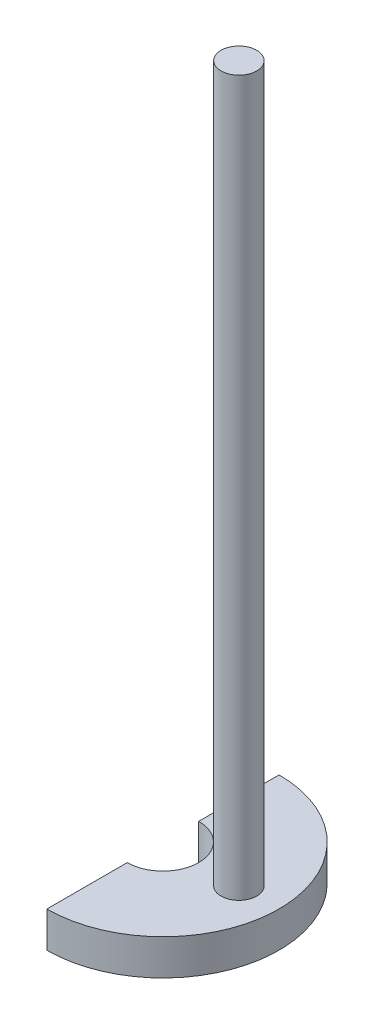
ISO-10303-21;
HEADER;
FILE_DESCRIPTION(('STEP AP214'),'2;1');
FILE_NAME('part.step','',(''),(''),'','','');
FILE_SCHEMA(('AUTOMOTIVE_DESIGN { 1 0 10303 214 1 1 1 1 }'));
ENDSEC;
DATA;
#1=APPLICATION_CONTEXT('core data for automotive mechanical design processes');
#2=APPLICATION_PROTOCOL_DEFINITION('international standard','automotive_design',2000,#1);
#3=PRODUCT_CONTEXT('',#1,'mechanical');
#4=PRODUCT('Part','Part','',(#3));
#5=PRODUCT_RELATED_PRODUCT_CATEGORY('part','',(#4));
#6=PRODUCT_DEFINITION_FORMATION('','',#4);
#7=PRODUCT_DEFINITION_CONTEXT('part definition',#1,'design');
#8=PRODUCT_DEFINITION('design','',#6,#7);
#9=PRODUCT_DEFINITION_SHAPE('','',#8);
#10=(LENGTH_UNIT() NAMED_UNIT(*) SI_UNIT(.MILLI.,.METRE.));
#11=(NAMED_UNIT(*) PLANE_ANGLE_UNIT() SI_UNIT($,.RADIAN.));
#12=(NAMED_UNIT(*) SI_UNIT($,.STERADIAN.) SOLID_ANGLE_UNIT());
#13=UNCERTAINTY_MEASURE_WITH_UNIT(LENGTH_MEASURE(1.E-05),#10,'distance_accuracy_value','');
#14=(GEOMETRIC_REPRESENTATION_CONTEXT(3) GLOBAL_UNCERTAINTY_ASSIGNED_CONTEXT((#13)) GLOBAL_UNIT_ASSIGNED_CONTEXT((#10,
#11,#12)) REPRESENTATION_CONTEXT('',''));
#15=CARTESIAN_POINT('',(0.,0.,0.));
#16=DIRECTION('',(0.,0.,1.));
#17=DIRECTION('',(1.,0.,0.));
#18=AXIS2_PLACEMENT_3D('',#15,#16,#17);
#19=CARTESIAN_POINT('',(0.,0.,0.));
#20=DIRECTION('',(1.,0.,0.));
#21=DIRECTION('',(0.,0.,-1.));
#22=AXIS2_PLACEMENT_3D('',#19,#20,#21);
#23=PLANE('',#22);
#24=DIRECTION('',(0.,0.,-1.));
#25=VECTOR('',#24,1.);
#26=CARTESIAN_POINT('',(0.,2.,0.));
#27=LINE('',#26,#25);
#28=CARTESIAN_POINT('',(0.,2.,6.5));
#29=VERTEX_POINT('',#28);
#30=CARTESIAN_POINT('',(0.,2.,2.));
#31=VERTEX_POINT('',#30);
#32=EDGE_CURVE('E57',#29,#31,#27,.T.);
#33=ORIENTED_EDGE('',*,*,#32,.T.);
#34=DIRECTION('',(0.,-1.,0.));
#35=VECTOR('',#34,1.);
#36=CARTESIAN_POINT('',(0.,2.,2.));
#37=LINE('',#36,#35);
#38=CARTESIAN_POINT('',(0.,0.,2.));
#39=VERTEX_POINT('',#38);
#40=EDGE_CURVE('E95',#31,#39,#37,.T.);
#41=ORIENTED_EDGE('',*,*,#40,.T.);
#42=DIRECTION('',(0.,0.,-1.));
#43=VECTOR('',#42,1.);
#44=CARTESIAN_POINT('',(0.,0.,0.));
#45=LINE('',#44,#43);
#46=CARTESIAN_POINT('',(0.,0.,6.5));
#47=VERTEX_POINT('',#46);
#48=EDGE_CURVE('E97',#47,#39,#45,.T.);
#49=ORIENTED_EDGE('',*,*,#48,.F.);
#50=DIRECTION('',(0.,-1.,0.));
#51=VECTOR('',#50,1.);
#52=CARTESIAN_POINT('',(0.,2.,6.5));
#53=LINE('',#52,#51);
#54=EDGE_CURVE('E51',#29,#47,#53,.T.);
#55=ORIENTED_EDGE('',*,*,#54,.F.);
#56=EDGE_LOOP('',(#33,#41,#49,#55));
#57=FACE_BOUND('',#56,.T.);
#58=ADVANCED_FACE('F47',(#57),#23,.F.);
#59=CARTESIAN_POINT('',(0.,2.,-2.));
#60=VERTEX_POINT('',#59);
#61=CARTESIAN_POINT('',(0.,2.,-6.5));
#62=VERTEX_POINT('',#61);
#63=EDGE_CURVE('E11',#60,#62,#27,.T.);
#64=ORIENTED_EDGE('',*,*,#63,.T.);
#65=DIRECTION('',(0.,-1.,0.));
#66=VECTOR('',#65,1.);
#67=CARTESIAN_POINT('',(0.,2.,-6.5));
#68=LINE('',#67,#66);
#69=CARTESIAN_POINT('',(0.,0.,-6.5));
#70=VERTEX_POINT('',#69);
#71=EDGE_CURVE('E72',#70,#62,#68,.F.);
#72=ORIENTED_EDGE('',*,*,#71,.F.);
#73=CARTESIAN_POINT('',(0.,0.,-2.));
#74=VERTEX_POINT('',#73);
#75=EDGE_CURVE('E102',#74,#70,#45,.T.);
#76=ORIENTED_EDGE('',*,*,#75,.F.);
#77=DIRECTION('',(0.,-1.,0.));
#78=VECTOR('',#77,1.);
#79=CARTESIAN_POINT('',(0.,2.,-2.));
#80=LINE('',#79,#78);
#81=EDGE_CURVE('E121',#74,#60,#80,.F.);
#82=ORIENTED_EDGE('',*,*,#81,.T.);
#83=EDGE_LOOP('',(#64,#72,#76,#82));
#84=FACE_BOUND('',#83,.T.);
#85=ADVANCED_FACE('F49',(#84),#23,.F.);
#86=CARTESIAN_POINT('',(4.25,42.,0.));
#87=DIRECTION('',(0.,1.,0.));
#88=DIRECTION('',(0.,0.,1.));
#89=AXIS2_PLACEMENT_3D('',#86,#87,#88);
#90=PLANE('',#89);
#91=CARTESIAN_POINT('',(4.25,42.,0.));
#92=DIRECTION('',(0.,1.,0.));
#93=DIRECTION('',(0.,0.,1.));
#94=AXIS2_PLACEMENT_3D('',#91,#92,#93);
#95=CIRCLE('',#94,1.);
#96=CARTESIAN_POINT('',(4.25,42.,0.999999999999999));
#97=VERTEX_POINT('',#96);
#98=EDGE_CURVE('E108',#97,#97,#95,.T.);
#99=ORIENTED_EDGE('',*,*,#98,.T.);
#100=EDGE_LOOP('',(#99));
#101=FACE_BOUND('',#100,.T.);
#102=ADVANCED_FACE('F148',(#101),#90,.T.);
#103=CARTESIAN_POINT('',(4.25,42.,0.));
#104=DIRECTION('',(0.,-1.,0.));
#105=DIRECTION('',(0.,0.,-1.));
#106=AXIS2_PLACEMENT_3D('',#103,#104,#105);
#107=CYLINDRICAL_SURFACE('',#106,1.);
#108=ORIENTED_EDGE('',*,*,#98,.F.);
#109=EDGE_LOOP('',(#108));
#110=FACE_BOUND('',#109,.T.);
#111=CARTESIAN_POINT('',(4.25,2.,0.));
#112=DIRECTION('',(0.,1.,0.));
#113=DIRECTION('',(0.,0.,1.));
#114=AXIS2_PLACEMENT_3D('',#111,#112,#113);
#115=CIRCLE('',#114,1.);
#116=CARTESIAN_POINT('',(4.25,2.,0.999999999999999));
#117=VERTEX_POINT('',#116);
#118=EDGE_CURVE('E114',#117,#117,#115,.T.);
#119=ORIENTED_EDGE('',*,*,#118,.T.);
#120=EDGE_LOOP('',(#119));
#121=FACE_BOUND('',#120,.T.);
#122=ADVANCED_FACE('F137',(#110,#121),#107,.T.);
#123=CARTESIAN_POINT('',(0.,2.,0.));
#124=DIRECTION('',(0.,-1.,0.));
#125=DIRECTION('',(0.,0.,-1.));
#126=AXIS2_PLACEMENT_3D('',#123,#124,#125);
#127=CYLINDRICAL_SURFACE('',#126,2.);
#128=ORIENTED_EDGE('',*,*,#40,.F.);
#129=CARTESIAN_POINT('',(0.,2.,0.));
#130=DIRECTION('',(0.,1.,0.));
#131=DIRECTION('',(0.,0.,1.));
#132=AXIS2_PLACEMENT_3D('',#129,#130,#131);
#133=CIRCLE('',#132,2.);
#134=EDGE_CURVE('E117',#31,#60,#133,.T.);
#135=ORIENTED_EDGE('',*,*,#134,.T.);
#136=ORIENTED_EDGE('',*,*,#81,.F.);
#137=CARTESIAN_POINT('',(0.,0.,0.));
#138=DIRECTION('',(0.,1.,0.));
#139=DIRECTION('',(0.,0.,1.));
#140=AXIS2_PLACEMENT_3D('',#137,#138,#139);
#141=CIRCLE('',#140,2.);
#142=EDGE_CURVE('E107',#39,#74,#141,.T.);
#143=ORIENTED_EDGE('',*,*,#142,.F.);
#144=EDGE_LOOP('',(#128,#135,#136,#143));
#145=FACE_BOUND('',#144,.T.);
#146=ADVANCED_FACE('F167',(#145),#127,.F.);
#147=CARTESIAN_POINT('',(0.,2.,0.));
#148=DIRECTION('',(0.,-1.,0.));
#149=DIRECTION('',(0.,0.,-1.));
#150=AXIS2_PLACEMENT_3D('',#147,#148,#149);
#151=CYLINDRICAL_SURFACE('',#150,6.5);
#152=CARTESIAN_POINT('',(0.,2.,0.));
#153=DIRECTION('',(0.,1.,0.));
#154=DIRECTION('',(0.,0.,1.));
#155=AXIS2_PLACEMENT_3D('',#152,#153,#154);
#156=CIRCLE('',#155,6.5);
#157=EDGE_CURVE('E93',#29,#62,#156,.T.);
#158=ORIENTED_EDGE('',*,*,#157,.F.);
#159=ORIENTED_EDGE('',*,*,#54,.T.);
#160=CARTESIAN_POINT('',(0.,0.,0.));
#161=DIRECTION('',(0.,1.,0.));
#162=DIRECTION('',(0.,0.,1.));
#163=AXIS2_PLACEMENT_3D('',#160,#161,#162);
#164=CIRCLE('',#163,6.5);
#165=EDGE_CURVE('E91',#47,#70,#164,.T.);
#166=ORIENTED_EDGE('',*,*,#165,.T.);
#167=ORIENTED_EDGE('',*,*,#71,.T.);
#168=EDGE_LOOP('',(#158,#159,#166,#167));
#169=FACE_BOUND('',#168,.T.);
#170=ADVANCED_FACE('F89',(#169),#151,.T.);
#171=CARTESIAN_POINT('',(0.,0.,0.));
#172=DIRECTION('',(0.,1.,0.));
#173=DIRECTION('',(0.,0.,1.));
#174=AXIS2_PLACEMENT_3D('',#171,#172,#173);
#175=PLANE('',#174);
#176=ORIENTED_EDGE('',*,*,#165,.F.);
#177=ORIENTED_EDGE('',*,*,#48,.T.);
#178=ORIENTED_EDGE('',*,*,#142,.T.);
#179=ORIENTED_EDGE('',*,*,#75,.T.);
#180=EDGE_LOOP('',(#176,#177,#178,#179));
#181=FACE_BOUND('',#180,.T.);
#182=ADVANCED_FACE('F104',(#181),#175,.F.);
#183=CARTESIAN_POINT('',(0.,2.,0.));
#184=DIRECTION('',(0.,1.,0.));
#185=DIRECTION('',(0.,0.,1.));
#186=AXIS2_PLACEMENT_3D('',#183,#184,#185);
#187=PLANE('',#186);
#188=ORIENTED_EDGE('',*,*,#32,.F.);
#189=ORIENTED_EDGE('',*,*,#157,.T.);
#190=ORIENTED_EDGE('',*,*,#63,.F.);
#191=ORIENTED_EDGE('',*,*,#134,.F.);
#192=EDGE_LOOP('',(#188,#189,#190,#191));
#193=FACE_BOUND('',#192,.T.);
#194=ORIENTED_EDGE('',*,*,#118,.F.);
#195=EDGE_LOOP('',(#194));
#196=FACE_BOUND('',#195,.T.);
#197=ADVANCED_FACE('F139',(#193,#196),#187,.T.);
#198=CLOSED_SHELL('',(#58,#85,#102,#122,#146,#170,#182,#197));
#199=MANIFOLD_SOLID_BREP('B2',#198);
#200=ADVANCED_BREP_SHAPE_REPRESENTATION('',(#18,#199),#14);
#201=SHAPE_DEFINITION_REPRESENTATION(#9,#200);
ENDSEC;
END-ISO-10303-21;
